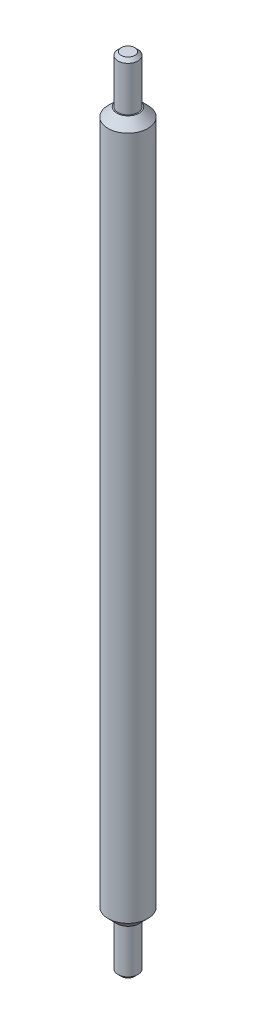
ISO-10303-21;
HEADER;
FILE_DESCRIPTION(('STEP AP214'),'2;1');
FILE_NAME('part.step','',(''),(''),'','','');
FILE_SCHEMA(('AUTOMOTIVE_DESIGN { 1 0 10303 214 1 1 1 1 }'));
ENDSEC;
DATA;
#1=APPLICATION_CONTEXT('core data for automotive mechanical design processes');
#2=APPLICATION_PROTOCOL_DEFINITION('international standard','automotive_design',2000,#1);
#3=PRODUCT_CONTEXT('',#1,'mechanical');
#4=PRODUCT('Part','Part','',(#3));
#5=PRODUCT_RELATED_PRODUCT_CATEGORY('part','',(#4));
#6=PRODUCT_DEFINITION_FORMATION('','',#4);
#7=PRODUCT_DEFINITION_CONTEXT('part definition',#1,'design');
#8=PRODUCT_DEFINITION('design','',#6,#7);
#9=PRODUCT_DEFINITION_SHAPE('','',#8);
#10=(LENGTH_UNIT() NAMED_UNIT(*) SI_UNIT(.MILLI.,.METRE.));
#11=(NAMED_UNIT(*) PLANE_ANGLE_UNIT() SI_UNIT($,.RADIAN.));
#12=(NAMED_UNIT(*) SI_UNIT($,.STERADIAN.) SOLID_ANGLE_UNIT());
#13=UNCERTAINTY_MEASURE_WITH_UNIT(LENGTH_MEASURE(1.E-05),#10,'distance_accuracy_value','');
#14=(GEOMETRIC_REPRESENTATION_CONTEXT(3) GLOBAL_UNCERTAINTY_ASSIGNED_CONTEXT((#13)) GLOBAL_UNIT_ASSIGNED_CONTEXT((#10,
#11,#12)) REPRESENTATION_CONTEXT('',''));
#15=CARTESIAN_POINT('',(0.,0.,0.));
#16=DIRECTION('',(0.,0.,1.));
#17=DIRECTION('',(1.,0.,0.));
#18=AXIS2_PLACEMENT_3D('',#15,#16,#17);
#19=CARTESIAN_POINT('',(0.,0.,0.));
#20=DIRECTION('',(0.,-1.,0.));
#21=DIRECTION('',(0.,0.,-1.));
#22=AXIS2_PLACEMENT_3D('',#19,#20,#21);
#23=PLANE('',#22);
#24=CARTESIAN_POINT('',(0.,0.,0.));
#25=DIRECTION('',(0.,-1.,0.));
#26=DIRECTION('',(0.,0.,-1.));
#27=AXIS2_PLACEMENT_3D('',#24,#25,#26);
#28=CIRCLE('',#27,1.69999999999998);
#29=CARTESIAN_POINT('',(0.,0.,-1.69999999999998));
#30=VERTEX_POINT('',#29);
#31=EDGE_CURVE('E53',#30,#30,#28,.F.);
#32=ORIENTED_EDGE('',*,*,#31,.T.);
#33=EDGE_LOOP('',(#32));
#34=FACE_BOUND('',#33,.T.);
#35=ADVANCED_FACE('F44',(#34),#23,.F.);
#36=CARTESIAN_POINT('',(0.,0.,0.));
#37=DIRECTION('',(0.,1.,0.));
#38=DIRECTION('',(0.,0.,1.));
#39=AXIS2_PLACEMENT_3D('',#36,#37,#38);
#40=CYLINDRICAL_SURFACE('',#39,2.5);
#41=CARTESIAN_POINT('',(0.,-0.799999999999995,0.));
#42=DIRECTION('',(0.,-1.,0.));
#43=DIRECTION('',(0.,0.,-1.));
#44=AXIS2_PLACEMENT_3D('',#41,#42,#43);
#45=CIRCLE('',#44,2.5);
#46=CARTESIAN_POINT('',(0.,-0.799999999999995,-2.5));
#47=VERTEX_POINT('',#46);
#48=EDGE_CURVE('E10',#47,#47,#45,.T.);
#49=ORIENTED_EDGE('',*,*,#48,.T.);
#50=EDGE_LOOP('',(#49));
#51=FACE_BOUND('',#50,.T.);
#52=CARTESIAN_POINT('',(0.,-12.,0.));
#53=DIRECTION('',(0.,1.,0.));
#54=DIRECTION('',(0.,0.,1.));
#55=AXIS2_PLACEMENT_3D('',#52,#53,#54);
#56=CIRCLE('',#55,2.5);
#57=CARTESIAN_POINT('',(0.,-12.,2.5));
#58=VERTEX_POINT('',#57);
#59=EDGE_CURVE('E87',#58,#58,#56,.T.);
#60=ORIENTED_EDGE('',*,*,#59,.T.);
#61=EDGE_LOOP('',(#60));
#62=FACE_BOUND('',#61,.T.);
#63=ADVANCED_FACE('F115',(#51,#62),#40,.T.);
#64=CARTESIAN_POINT('',(2.5,-12.,0.));
#65=DIRECTION('',(0.,-1.,0.));
#66=DIRECTION('',(0.,0.,-1.));
#67=AXIS2_PLACEMENT_3D('',#64,#65,#66);
#68=PLANE('',#67);
#69=CARTESIAN_POINT('',(0.,-12.,0.));
#70=DIRECTION('',(0.,-1.,0.));
#71=DIRECTION('',(0.,0.,-1.));
#72=AXIS2_PLACEMENT_3D('',#69,#70,#71);
#73=CIRCLE('',#72,2.80000000000002);
#74=CARTESIAN_POINT('',(0.,-12.,-2.80000000000002));
#75=VERTEX_POINT('',#74);
#76=EDGE_CURVE('E71',#75,#75,#73,.F.);
#77=ORIENTED_EDGE('',*,*,#76,.T.);
#78=EDGE_LOOP('',(#77));
#79=FACE_BOUND('',#78,.T.);
#80=ORIENTED_EDGE('',*,*,#59,.F.);
#81=EDGE_LOOP('',(#80));
#82=FACE_BOUND('',#81,.T.);
#83=ADVANCED_FACE('F120',(#79,#82),#68,.F.);
#84=CARTESIAN_POINT('',(0.,0.,0.));
#85=DIRECTION('',(0.,1.,0.));
#86=DIRECTION('',(0.,0.,1.));
#87=AXIS2_PLACEMENT_3D('',#84,#85,#86);
#88=CYLINDRICAL_SURFACE('',#87,5.00000000000001);
#89=CARTESIAN_POINT('',(0.,-185.8,0.));
#90=DIRECTION('',(0.,1.,0.));
#91=DIRECTION('',(0.,0.,1.));
#92=AXIS2_PLACEMENT_3D('',#89,#90,#91);
#93=CIRCLE('',#92,5.00000000000001);
#94=CARTESIAN_POINT('',(0.,-185.8,5.00000000000001));
#95=VERTEX_POINT('',#94);
#96=EDGE_CURVE('E79',#95,#95,#93,.T.);
#97=ORIENTED_EDGE('',*,*,#96,.T.);
#98=EDGE_LOOP('',(#97));
#99=FACE_BOUND('',#98,.T.);
#100=CARTESIAN_POINT('',(0.,-14.2,0.));
#101=DIRECTION('',(0.,-1.,0.));
#102=DIRECTION('',(0.,0.,-1.));
#103=AXIS2_PLACEMENT_3D('',#100,#101,#102);
#104=CIRCLE('',#103,5.00000000000001);
#105=CARTESIAN_POINT('',(0.,-14.2,-5.00000000000001));
#106=VERTEX_POINT('',#105);
#107=EDGE_CURVE('E83',#106,#106,#104,.T.);
#108=ORIENTED_EDGE('',*,*,#107,.T.);
#109=EDGE_LOOP('',(#108));
#110=FACE_BOUND('',#109,.T.);
#111=ADVANCED_FACE('F111',(#99,#110),#88,.T.);
#112=CARTESIAN_POINT('',(5.00000000000002,-188.,0.));
#113=DIRECTION('',(0.,1.,0.));
#114=DIRECTION('',(0.,0.,1.));
#115=AXIS2_PLACEMENT_3D('',#112,#113,#114);
#116=PLANE('',#115);
#117=CARTESIAN_POINT('',(0.,-188.,0.));
#118=DIRECTION('',(0.,1.,0.));
#119=DIRECTION('',(0.,0.,1.));
#120=AXIS2_PLACEMENT_3D('',#117,#118,#119);
#121=CIRCLE('',#120,2.80000000000005);
#122=CARTESIAN_POINT('',(0.,-188.,2.80000000000005));
#123=VERTEX_POINT('',#122);
#124=EDGE_CURVE('E75',#123,#123,#121,.F.);
#125=ORIENTED_EDGE('',*,*,#124,.T.);
#126=EDGE_LOOP('',(#125));
#127=FACE_BOUND('',#126,.T.);
#128=CARTESIAN_POINT('',(0.,-188.,0.));
#129=DIRECTION('',(0.,1.,0.));
#130=DIRECTION('',(0.,0.,1.));
#131=AXIS2_PLACEMENT_3D('',#128,#129,#130);
#132=CIRCLE('',#131,2.50000000000001);
#133=CARTESIAN_POINT('',(0.,-188.,2.50000000000001));
#134=VERTEX_POINT('',#133);
#135=EDGE_CURVE('E91',#134,#134,#132,.T.);
#136=ORIENTED_EDGE('',*,*,#135,.T.);
#137=EDGE_LOOP('',(#136));
#138=FACE_BOUND('',#137,.T.);
#139=ADVANCED_FACE('F97',(#127,#138),#116,.F.);
#140=CARTESIAN_POINT('',(0.,0.,0.));
#141=DIRECTION('',(0.,1.,0.));
#142=DIRECTION('',(0.,0.,1.));
#143=AXIS2_PLACEMENT_3D('',#140,#141,#142);
#144=CYLINDRICAL_SURFACE('',#143,2.50000000000001);
#145=CARTESIAN_POINT('',(0.,-199.2,0.));
#146=DIRECTION('',(0.,1.,0.));
#147=DIRECTION('',(0.,0.,1.));
#148=AXIS2_PLACEMENT_3D('',#145,#146,#147);
#149=CIRCLE('',#148,2.50000000000001);
#150=CARTESIAN_POINT('',(0.,-199.2,2.50000000000001));
#151=VERTEX_POINT('',#150);
#152=EDGE_CURVE('E65',#151,#151,#149,.T.);
#153=ORIENTED_EDGE('',*,*,#152,.T.);
#154=EDGE_LOOP('',(#153));
#155=FACE_BOUND('',#154,.T.);
#156=ORIENTED_EDGE('',*,*,#135,.F.);
#157=EDGE_LOOP('',(#156));
#158=FACE_BOUND('',#157,.T.);
#159=ADVANCED_FACE('F99',(#155,#158),#144,.T.);
#160=CARTESIAN_POINT('',(2.50000000000001,-200.,0.));
#161=DIRECTION('',(0.,1.,0.));
#162=DIRECTION('',(0.,0.,1.));
#163=AXIS2_PLACEMENT_3D('',#160,#161,#162);
#164=PLANE('',#163);
#165=CARTESIAN_POINT('',(0.,-200.,0.));
#166=DIRECTION('',(0.,1.,0.));
#167=DIRECTION('',(0.,0.,1.));
#168=AXIS2_PLACEMENT_3D('',#165,#166,#167);
#169=CIRCLE('',#168,1.70000000000003);
#170=CARTESIAN_POINT('',(0.,-200.,1.70000000000005));
#171=VERTEX_POINT('',#170);
#172=EDGE_CURVE('E59',#171,#171,#169,.F.);
#173=ORIENTED_EDGE('',*,*,#172,.T.);
#174=EDGE_LOOP('',(#173));
#175=FACE_BOUND('',#174,.T.);
#176=ADVANCED_FACE('F101',(#175),#164,.F.);
#177=CARTESIAN_POINT('',(0.,-185.8,0.));
#178=DIRECTION('',(0.,1.,0.));
#179=DIRECTION('',(0.,0.,1.));
#180=AXIS2_PLACEMENT_3D('',#177,#178,#179);
#181=CONICAL_SURFACE('',#180,5.00000000000001,0.785398163397444);
#182=ORIENTED_EDGE('',*,*,#124,.F.);
#183=EDGE_LOOP('',(#182));
#184=FACE_BOUND('',#183,.T.);
#185=ORIENTED_EDGE('',*,*,#96,.F.);
#186=EDGE_LOOP('',(#185));
#187=FACE_BOUND('',#186,.T.);
#188=ADVANCED_FACE('F108',(#184,#187),#181,.T.);
#189=CARTESIAN_POINT('',(0.,-12.,0.));
#190=DIRECTION('',(0.,-1.,0.));
#191=DIRECTION('',(0.,0.,-1.));
#192=AXIS2_PLACEMENT_3D('',#189,#190,#191);
#193=CONICAL_SURFACE('',#192,2.80000000000002,0.78539816339745);
#194=ORIENTED_EDGE('',*,*,#107,.F.);
#195=EDGE_LOOP('',(#194));
#196=FACE_BOUND('',#195,.T.);
#197=ORIENTED_EDGE('',*,*,#76,.F.);
#198=EDGE_LOOP('',(#197));
#199=FACE_BOUND('',#198,.T.);
#200=ADVANCED_FACE('F130',(#196,#199),#193,.T.);
#201=CARTESIAN_POINT('',(0.,-199.2,0.));
#202=DIRECTION('',(0.,1.,0.));
#203=DIRECTION('',(0.,0.,1.));
#204=AXIS2_PLACEMENT_3D('',#201,#202,#203);
#205=CONICAL_SURFACE('',#204,2.50000000000001,0.785398163397438);
#206=ORIENTED_EDGE('',*,*,#172,.F.);
#207=EDGE_LOOP('',(#206));
#208=FACE_BOUND('',#207,.T.);
#209=ORIENTED_EDGE('',*,*,#152,.F.);
#210=EDGE_LOOP('',(#209));
#211=FACE_BOUND('',#210,.T.);
#212=ADVANCED_FACE('F136',(#208,#211),#205,.T.);
#213=CARTESIAN_POINT('',(0.,0.,0.));
#214=DIRECTION('',(0.,-1.,0.));
#215=DIRECTION('',(0.,0.,-1.));
#216=AXIS2_PLACEMENT_3D('',#213,#214,#215);
#217=CONICAL_SURFACE('',#216,1.69999999999998,0.785398163397461);
#218=ORIENTED_EDGE('',*,*,#48,.F.);
#219=EDGE_LOOP('',(#218));
#220=FACE_BOUND('',#219,.T.);
#221=ORIENTED_EDGE('',*,*,#31,.F.);
#222=EDGE_LOOP('',(#221));
#223=FACE_BOUND('',#222,.T.);
#224=ADVANCED_FACE('F47',(#220,#223),#217,.T.);
#225=CLOSED_SHELL('',(#35,#63,#83,#111,#139,#159,#176,#188,#200,#212,#224));
#226=MANIFOLD_SOLID_BREP('B2',#225);
#227=ADVANCED_BREP_SHAPE_REPRESENTATION('',(#18,#226),#14);
#228=SHAPE_DEFINITION_REPRESENTATION(#9,#227);
ENDSEC;
END-ISO-10303-21;
